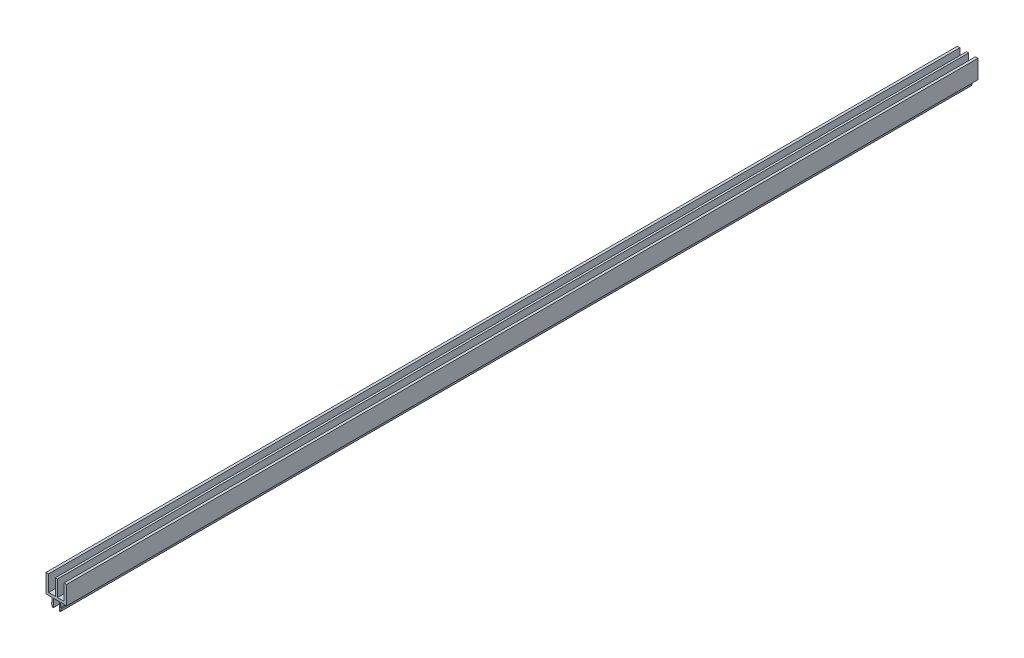
ISO-10303-21;
HEADER;
FILE_DESCRIPTION(('STEP AP214'),'2;1');
FILE_NAME('part.step','',(''),(''),'','','');
FILE_SCHEMA(('AUTOMOTIVE_DESIGN { 1 0 10303 214 1 1 1 1 }'));
ENDSEC;
DATA;
#1=APPLICATION_CONTEXT('core data for automotive mechanical design processes');
#2=APPLICATION_PROTOCOL_DEFINITION('international standard','automotive_design',2000,#1);
#3=PRODUCT_CONTEXT('',#1,'mechanical');
#4=PRODUCT('Part','Part','',(#3));
#5=PRODUCT_RELATED_PRODUCT_CATEGORY('part','',(#4));
#6=PRODUCT_DEFINITION_FORMATION('','',#4);
#7=PRODUCT_DEFINITION_CONTEXT('part definition',#1,'design');
#8=PRODUCT_DEFINITION('design','',#6,#7);
#9=PRODUCT_DEFINITION_SHAPE('','',#8);
#10=(LENGTH_UNIT() NAMED_UNIT(*) SI_UNIT(.MILLI.,.METRE.));
#11=(NAMED_UNIT(*) PLANE_ANGLE_UNIT() SI_UNIT($,.RADIAN.));
#12=(NAMED_UNIT(*) SI_UNIT($,.STERADIAN.) SOLID_ANGLE_UNIT());
#13=UNCERTAINTY_MEASURE_WITH_UNIT(LENGTH_MEASURE(1.E-05),#10,'distance_accuracy_value','');
#14=(GEOMETRIC_REPRESENTATION_CONTEXT(3) GLOBAL_UNCERTAINTY_ASSIGNED_CONTEXT((#13)) GLOBAL_UNIT_ASSIGNED_CONTEXT((#10,
#11,#12)) REPRESENTATION_CONTEXT('',''));
#15=CARTESIAN_POINT('',(0.,0.,0.));
#16=DIRECTION('',(0.,0.,1.));
#17=DIRECTION('',(1.,0.,0.));
#18=AXIS2_PLACEMENT_3D('',#15,#16,#17);
#19=CARTESIAN_POINT('',(-1.,17.9999999975,-829.));
#20=DIRECTION('',(-1.,0.,0.));
#21=DIRECTION('',(0.,-1.,0.));
#22=AXIS2_PLACEMENT_3D('',#19,#20,#21);
#23=PLANE('',#22);
#24=DIRECTION('',(0.,-1.,0.));
#25=VECTOR('',#24,1.);
#26=CARTESIAN_POINT('',(-1.,17.9999999975,50.));
#27=LINE('',#26,#25);
#28=CARTESIAN_POINT('',(-1.,17.9999999975,50.));
#29=VERTEX_POINT('',#28);
#30=CARTESIAN_POINT('',(-1.,2.4999999995,50.));
#31=VERTEX_POINT('',#30);
#32=EDGE_CURVE('E226',#29,#31,#27,.T.);
#33=ORIENTED_EDGE('',*,*,#32,.F.);
#34=DIRECTION('',(0.,0.,1.));
#35=VECTOR('',#34,1.);
#36=CARTESIAN_POINT('',(-1.,17.9999999975,-829.));
#37=LINE('',#36,#35);
#38=CARTESIAN_POINT('',(-1.,17.9999999975,-829.));
#39=VERTEX_POINT('',#38);
#40=EDGE_CURVE('E11',#39,#29,#37,.T.);
#41=ORIENTED_EDGE('',*,*,#40,.F.);
#42=DIRECTION('',(0.,-1.,0.));
#43=VECTOR('',#42,1.);
#44=CARTESIAN_POINT('',(-1.,17.9999999975,-829.));
#45=LINE('',#44,#43);
#46=CARTESIAN_POINT('',(-1.,2.4999999995,-829.));
#47=VERTEX_POINT('',#46);
#48=EDGE_CURVE('E294',#39,#47,#45,.T.);
#49=ORIENTED_EDGE('',*,*,#48,.T.);
#50=DIRECTION('',(0.,0.,1.));
#51=VECTOR('',#50,1.);
#52=CARTESIAN_POINT('',(-1.,2.4999999995,-829.));
#53=LINE('',#52,#51);
#54=EDGE_CURVE('E36',#47,#31,#53,.T.);
#55=ORIENTED_EDGE('',*,*,#54,.T.);
#56=EDGE_LOOP('',(#33,#41,#49,#55));
#57=FACE_BOUND('',#56,.T.);
#58=ADVANCED_FACE('F33',(#57),#23,.T.);
#59=CARTESIAN_POINT('',(0.999999999999998,17.9999999975,-829.));
#60=DIRECTION('',(0.,1.,0.));
#61=DIRECTION('',(0.,0.,1.));
#62=AXIS2_PLACEMENT_3D('',#59,#60,#61);
#63=PLANE('',#62);
#64=DIRECTION('',(-1.,0.,0.));
#65=VECTOR('',#64,1.);
#66=CARTESIAN_POINT('',(0.999999999999998,17.9999999975,50.));
#67=LINE('',#66,#65);
#68=CARTESIAN_POINT('',(0.999999999999998,17.9999999975,50.));
#69=VERTEX_POINT('',#68);
#70=EDGE_CURVE('E292',#69,#29,#67,.T.);
#71=ORIENTED_EDGE('',*,*,#70,.F.);
#72=DIRECTION('',(0.,0.,1.));
#73=VECTOR('',#72,1.);
#74=CARTESIAN_POINT('',(0.999999999999998,17.9999999975,-829.));
#75=LINE('',#74,#73);
#76=CARTESIAN_POINT('',(0.999999999999998,17.9999999975,-829.));
#77=VERTEX_POINT('',#76);
#78=EDGE_CURVE('E42',#77,#69,#75,.T.);
#79=ORIENTED_EDGE('',*,*,#78,.F.);
#80=DIRECTION('',(-1.,0.,0.));
#81=VECTOR('',#80,1.);
#82=CARTESIAN_POINT('',(0.999999999999998,17.9999999975,-829.));
#83=LINE('',#82,#81);
#84=EDGE_CURVE('E216',#77,#39,#83,.T.);
#85=ORIENTED_EDGE('',*,*,#84,.T.);
#86=ORIENTED_EDGE('',*,*,#40,.T.);
#87=EDGE_LOOP('',(#71,#79,#85,#86));
#88=FACE_BOUND('',#87,.T.);
#89=ADVANCED_FACE('F338',(#88),#63,.T.);
#90=CARTESIAN_POINT('',(0.999999999999998,2.4999999995,-829.));
#91=DIRECTION('',(1.,0.,0.));
#92=DIRECTION('',(0.,0.,-1.));
#93=AXIS2_PLACEMENT_3D('',#90,#91,#92);
#94=PLANE('',#93);
#95=DIRECTION('',(0.,1.,0.));
#96=VECTOR('',#95,1.);
#97=CARTESIAN_POINT('',(0.999999999999998,2.4999999995,50.));
#98=LINE('',#97,#96);
#99=CARTESIAN_POINT('',(0.999999999999998,2.4999999995,50.));
#100=VERTEX_POINT('',#99);
#101=EDGE_CURVE('E203',#100,#69,#98,.T.);
#102=ORIENTED_EDGE('',*,*,#101,.F.);
#103=DIRECTION('',(0.,0.,1.));
#104=VECTOR('',#103,1.);
#105=CARTESIAN_POINT('',(0.999999999999998,2.4999999995,-829.));
#106=LINE('',#105,#104);
#107=CARTESIAN_POINT('',(0.999999999999998,2.4999999995,-829.));
#108=VERTEX_POINT('',#107);
#109=EDGE_CURVE('E198',#108,#100,#106,.T.);
#110=ORIENTED_EDGE('',*,*,#109,.F.);
#111=DIRECTION('',(0.,1.,0.));
#112=VECTOR('',#111,1.);
#113=CARTESIAN_POINT('',(0.999999999999998,2.4999999995,-829.));
#114=LINE('',#113,#112);
#115=EDGE_CURVE('E201',#108,#77,#114,.T.);
#116=ORIENTED_EDGE('',*,*,#115,.T.);
#117=ORIENTED_EDGE('',*,*,#78,.T.);
#118=EDGE_LOOP('',(#102,#110,#116,#117));
#119=FACE_BOUND('',#118,.T.);
#120=ADVANCED_FACE('F200',(#119),#94,.T.);
#121=CARTESIAN_POINT('',(7.5,2.4999999995,-829.));
#122=DIRECTION('',(0.,1.,0.));
#123=DIRECTION('',(-1.,0.,0.));
#124=AXIS2_PLACEMENT_3D('',#121,#122,#123);
#125=PLANE('',#124);
#126=DIRECTION('',(-1.,0.,0.));
#127=VECTOR('',#126,1.);
#128=CARTESIAN_POINT('',(7.5,2.4999999995,50.));
#129=LINE('',#128,#127);
#130=CARTESIAN_POINT('',(7.5,2.4999999995,50.));
#131=VERTEX_POINT('',#130);
#132=EDGE_CURVE('E289',#131,#100,#129,.T.);
#133=ORIENTED_EDGE('',*,*,#132,.F.);
#134=DIRECTION('',(0.,0.,1.));
#135=VECTOR('',#134,1.);
#136=CARTESIAN_POINT('',(7.5,2.4999999995,-829.));
#137=LINE('',#136,#135);
#138=CARTESIAN_POINT('',(7.5,2.4999999995,-829.));
#139=VERTEX_POINT('',#138);
#140=EDGE_CURVE('E208',#139,#131,#137,.T.);
#141=ORIENTED_EDGE('',*,*,#140,.F.);
#142=DIRECTION('',(-1.,0.,0.));
#143=VECTOR('',#142,1.);
#144=CARTESIAN_POINT('',(7.5,2.4999999995,-829.));
#145=LINE('',#144,#143);
#146=EDGE_CURVE('E214',#139,#108,#145,.T.);
#147=ORIENTED_EDGE('',*,*,#146,.T.);
#148=ORIENTED_EDGE('',*,*,#109,.T.);
#149=EDGE_LOOP('',(#133,#141,#147,#148));
#150=FACE_BOUND('',#149,.T.);
#151=ADVANCED_FACE('F218',(#150),#125,.T.);
#152=CARTESIAN_POINT('',(7.5,17.9999999975,-829.));
#153=DIRECTION('',(-1.,0.,0.));
#154=DIRECTION('',(0.,-1.,0.));
#155=AXIS2_PLACEMENT_3D('',#152,#153,#154);
#156=PLANE('',#155);
#157=DIRECTION('',(0.,-1.,0.));
#158=VECTOR('',#157,1.);
#159=CARTESIAN_POINT('',(7.5,17.9999999975,50.));
#160=LINE('',#159,#158);
#161=CARTESIAN_POINT('',(7.5,17.9999999975,50.));
#162=VERTEX_POINT('',#161);
#163=EDGE_CURVE('E286',#162,#131,#160,.T.);
#164=ORIENTED_EDGE('',*,*,#163,.F.);
#165=DIRECTION('',(0.,0.,1.));
#166=VECTOR('',#165,1.);
#167=CARTESIAN_POINT('',(7.5,17.9999999975,-829.));
#168=LINE('',#167,#166);
#169=CARTESIAN_POINT('',(7.5,17.9999999975,-829.));
#170=VERTEX_POINT('',#169);
#171=EDGE_CURVE('E298',#170,#162,#168,.T.);
#172=ORIENTED_EDGE('',*,*,#171,.F.);
#173=DIRECTION('',(0.,-1.,0.));
#174=VECTOR('',#173,1.);
#175=CARTESIAN_POINT('',(7.5,17.9999999975,-829.));
#176=LINE('',#175,#174);
#177=EDGE_CURVE('E219',#170,#139,#176,.T.);
#178=ORIENTED_EDGE('',*,*,#177,.T.);
#179=ORIENTED_EDGE('',*,*,#140,.T.);
#180=EDGE_LOOP('',(#164,#172,#178,#179));
#181=FACE_BOUND('',#180,.T.);
#182=ADVANCED_FACE('F351',(#181),#156,.T.);
#183=CARTESIAN_POINT('',(10.,17.9999999975,-829.));
#184=DIRECTION('',(0.,1.,0.));
#185=DIRECTION('',(0.,0.,1.));
#186=AXIS2_PLACEMENT_3D('',#183,#184,#185);
#187=PLANE('',#186);
#188=DIRECTION('',(-1.,0.,0.));
#189=VECTOR('',#188,1.);
#190=CARTESIAN_POINT('',(10.,17.9999999975,50.));
#191=LINE('',#190,#189);
#192=CARTESIAN_POINT('',(10.,17.9999999975,50.));
#193=VERTEX_POINT('',#192);
#194=EDGE_CURVE('E283',#193,#162,#191,.T.);
#195=ORIENTED_EDGE('',*,*,#194,.F.);
#196=DIRECTION('',(0.,0.,1.));
#197=VECTOR('',#196,1.);
#198=CARTESIAN_POINT('',(10.,17.9999999975,-829.));
#199=LINE('',#198,#197);
#200=CARTESIAN_POINT('',(10.,17.9999999975,-829.));
#201=VERTEX_POINT('',#200);
#202=EDGE_CURVE('E300',#201,#193,#199,.T.);
#203=ORIENTED_EDGE('',*,*,#202,.F.);
#204=DIRECTION('',(-1.,0.,0.));
#205=VECTOR('',#204,1.);
#206=CARTESIAN_POINT('',(10.,17.9999999975,-829.));
#207=LINE('',#206,#205);
#208=EDGE_CURVE('E221',#201,#170,#207,.T.);
#209=ORIENTED_EDGE('',*,*,#208,.T.);
#210=ORIENTED_EDGE('',*,*,#171,.T.);
#211=EDGE_LOOP('',(#195,#203,#209,#210));
#212=FACE_BOUND('',#211,.T.);
#213=ADVANCED_FACE('F354',(#212),#187,.T.);
#214=CARTESIAN_POINT('',(10.,-4.99999828349541E-10,-829.));
#215=DIRECTION('',(1.,0.,0.));
#216=DIRECTION('',(0.,0.,-1.));
#217=AXIS2_PLACEMENT_3D('',#214,#215,#216);
#218=PLANE('',#217);
#219=DIRECTION('',(0.,1.,0.));
#220=VECTOR('',#219,1.);
#221=CARTESIAN_POINT('',(10.,-4.99999828349541E-10,50.));
#222=LINE('',#221,#220);
#223=CARTESIAN_POINT('',(10.,-4.99999828349541E-10,50.));
#224=VERTEX_POINT('',#223);
#225=EDGE_CURVE('E280',#224,#193,#222,.T.);
#226=ORIENTED_EDGE('',*,*,#225,.F.);
#227=DIRECTION('',(0.,0.,1.));
#228=VECTOR('',#227,1.);
#229=CARTESIAN_POINT('',(10.,-4.99999828349541E-10,-829.));
#230=LINE('',#229,#228);
#231=CARTESIAN_POINT('',(10.,-4.99999828349541E-10,-829.));
#232=VERTEX_POINT('',#231);
#233=EDGE_CURVE('E302',#232,#224,#230,.T.);
#234=ORIENTED_EDGE('',*,*,#233,.F.);
#235=DIRECTION('',(0.,1.,0.));
#236=VECTOR('',#235,1.);
#237=CARTESIAN_POINT('',(10.,-4.99999828349541E-10,-829.));
#238=LINE('',#237,#236);
#239=EDGE_CURVE('E644',#232,#201,#238,.T.);
#240=ORIENTED_EDGE('',*,*,#239,.T.);
#241=ORIENTED_EDGE('',*,*,#202,.T.);
#242=EDGE_LOOP('',(#226,#234,#240,#241));
#243=FACE_BOUND('',#242,.T.);
#244=ADVANCED_FACE('F358',(#243),#218,.T.);
#245=CARTESIAN_POINT('',(4.,-4.99999998002099E-10,-829.));
#246=DIRECTION('',(0.,-1.,0.));
#247=DIRECTION('',(1.,0.,0.));
#248=AXIS2_PLACEMENT_3D('',#245,#246,#247);
#249=PLANE('',#248);
#250=DIRECTION('',(1.,0.,0.));
#251=VECTOR('',#250,1.);
#252=CARTESIAN_POINT('',(4.,-4.99999998002099E-10,50.));
#253=LINE('',#252,#251);
#254=CARTESIAN_POINT('',(4.,-4.99999998002099E-10,50.));
#255=VERTEX_POINT('',#254);
#256=EDGE_CURVE('E277',#255,#224,#253,.T.);
#257=ORIENTED_EDGE('',*,*,#256,.F.);
#258=DIRECTION('',(0.,0.,1.));
#259=VECTOR('',#258,1.);
#260=CARTESIAN_POINT('',(4.,-4.99999998002099E-10,-829.));
#261=LINE('',#260,#259);
#262=CARTESIAN_POINT('',(4.,-4.99999998002099E-10,-829.));
#263=VERTEX_POINT('',#262);
#264=EDGE_CURVE('E304',#263,#255,#261,.T.);
#265=ORIENTED_EDGE('',*,*,#264,.F.);
#266=DIRECTION('',(1.,0.,0.));
#267=VECTOR('',#266,1.);
#268=CARTESIAN_POINT('',(4.,-4.99999998002099E-10,-829.));
#269=LINE('',#268,#267);
#270=EDGE_CURVE('E648',#263,#232,#269,.T.);
#271=ORIENTED_EDGE('',*,*,#270,.T.);
#272=ORIENTED_EDGE('',*,*,#233,.T.);
#273=EDGE_LOOP('',(#257,#265,#271,#272));
#274=FACE_BOUND('',#273,.T.);
#275=ADVANCED_FACE('F362',(#274),#249,.T.);
#276=CARTESIAN_POINT('',(4.,-4.5,-829.));
#277=DIRECTION('',(1.,0.,0.));
#278=DIRECTION('',(0.,0.,-1.));
#279=AXIS2_PLACEMENT_3D('',#276,#277,#278);
#280=PLANE('',#279);
#281=DIRECTION('',(0.,1.,0.));
#282=VECTOR('',#281,1.);
#283=CARTESIAN_POINT('',(4.,-4.5,50.));
#284=LINE('',#283,#282);
#285=CARTESIAN_POINT('',(4.,-4.5,50.));
#286=VERTEX_POINT('',#285);
#287=EDGE_CURVE('E274',#286,#255,#284,.T.);
#288=ORIENTED_EDGE('',*,*,#287,.F.);
#289=DIRECTION('',(0.,0.,1.));
#290=VECTOR('',#289,1.);
#291=CARTESIAN_POINT('',(4.,-4.5,-829.));
#292=LINE('',#291,#290);
#293=CARTESIAN_POINT('',(4.,-4.5,-829.));
#294=VERTEX_POINT('',#293);
#295=EDGE_CURVE('E306',#294,#286,#292,.T.);
#296=ORIENTED_EDGE('',*,*,#295,.F.);
#297=DIRECTION('',(0.,1.,0.));
#298=VECTOR('',#297,1.);
#299=CARTESIAN_POINT('',(4.,-4.5,-829.));
#300=LINE('',#299,#298);
#301=EDGE_CURVE('E637',#294,#263,#300,.T.);
#302=ORIENTED_EDGE('',*,*,#301,.T.);
#303=ORIENTED_EDGE('',*,*,#264,.T.);
#304=EDGE_LOOP('',(#288,#296,#302,#303));
#305=FACE_BOUND('',#304,.T.);
#306=ADVANCED_FACE('F366',(#305),#280,.T.);
#307=CARTESIAN_POINT('',(5.,-4.5,-829.));
#308=DIRECTION('',(0.,1.,0.));
#309=DIRECTION('',(0.,0.,1.));
#310=AXIS2_PLACEMENT_3D('',#307,#308,#309);
#311=PLANE('',#310);
#312=DIRECTION('',(-1.,0.,0.));
#313=VECTOR('',#312,1.);
#314=CARTESIAN_POINT('',(5.,-4.5,50.));
#315=LINE('',#314,#313);
#316=CARTESIAN_POINT('',(5.,-4.5,50.));
#317=VERTEX_POINT('',#316);
#318=EDGE_CURVE('E271',#317,#286,#315,.T.);
#319=ORIENTED_EDGE('',*,*,#318,.F.);
#320=DIRECTION('',(0.,0.,1.));
#321=VECTOR('',#320,1.);
#322=CARTESIAN_POINT('',(5.,-4.5,-829.));
#323=LINE('',#322,#321);
#324=CARTESIAN_POINT('',(5.,-4.5,-829.));
#325=VERTEX_POINT('',#324);
#326=EDGE_CURVE('E308',#325,#317,#323,.T.);
#327=ORIENTED_EDGE('',*,*,#326,.F.);
#328=DIRECTION('',(-1.,0.,0.));
#329=VECTOR('',#328,1.);
#330=CARTESIAN_POINT('',(5.,-4.5,-829.));
#331=LINE('',#330,#329);
#332=EDGE_CURVE('E633',#325,#294,#331,.T.);
#333=ORIENTED_EDGE('',*,*,#332,.T.);
#334=ORIENTED_EDGE('',*,*,#295,.T.);
#335=EDGE_LOOP('',(#319,#327,#333,#334));
#336=FACE_BOUND('',#335,.T.);
#337=ADVANCED_FACE('F370',(#336),#311,.T.);
#338=CARTESIAN_POINT('',(3.75,-8.,-829.));
#339=DIRECTION('',(0.941741911594837,-0.336336396998157,0.));
#340=DIRECTION('',(0.336336396998157,0.941741911594837,0.));
#341=AXIS2_PLACEMENT_3D('',#338,#339,#340);
#342=PLANE('',#341);
#343=DIRECTION('',(0.336336396998157,0.941741911594837,0.));
#344=VECTOR('',#343,1.);
#345=CARTESIAN_POINT('',(3.75,-8.,50.));
#346=LINE('',#345,#344);
#347=CARTESIAN_POINT('',(3.75,-8.,50.));
#348=VERTEX_POINT('',#347);
#349=EDGE_CURVE('E268',#348,#317,#346,.T.);
#350=ORIENTED_EDGE('',*,*,#349,.F.);
#351=DIRECTION('',(0.,0.,1.));
#352=VECTOR('',#351,1.);
#353=CARTESIAN_POINT('',(3.75,-8.,-829.));
#354=LINE('',#353,#352);
#355=CARTESIAN_POINT('',(3.75,-8.,-829.));
#356=VERTEX_POINT('',#355);
#357=EDGE_CURVE('E310',#356,#348,#354,.T.);
#358=ORIENTED_EDGE('',*,*,#357,.F.);
#359=DIRECTION('',(0.336336396998157,0.941741911594837,0.));
#360=VECTOR('',#359,1.);
#361=CARTESIAN_POINT('',(3.75,-8.,-829.));
#362=LINE('',#361,#360);
#363=EDGE_CURVE('E654',#356,#325,#362,.T.);
#364=ORIENTED_EDGE('',*,*,#363,.T.);
#365=ORIENTED_EDGE('',*,*,#326,.T.);
#366=EDGE_LOOP('',(#350,#358,#364,#365));
#367=FACE_BOUND('',#366,.T.);
#368=ADVANCED_FACE('F374',(#367),#342,.T.);
#369=CARTESIAN_POINT('',(3.,-8.,-829.));
#370=DIRECTION('',(0.,-1.,0.));
#371=DIRECTION('',(0.,0.,-1.));
#372=AXIS2_PLACEMENT_3D('',#369,#370,#371);
#373=PLANE('',#372);
#374=DIRECTION('',(1.,0.,0.));
#375=VECTOR('',#374,1.);
#376=CARTESIAN_POINT('',(3.,-8.,50.));
#377=LINE('',#376,#375);
#378=CARTESIAN_POINT('',(3.,-8.,50.));
#379=VERTEX_POINT('',#378);
#380=EDGE_CURVE('E265',#379,#348,#377,.T.);
#381=ORIENTED_EDGE('',*,*,#380,.F.);
#382=DIRECTION('',(0.,0.,1.));
#383=VECTOR('',#382,1.);
#384=CARTESIAN_POINT('',(3.,-8.,-829.));
#385=LINE('',#384,#383);
#386=CARTESIAN_POINT('',(3.,-8.,-829.));
#387=VERTEX_POINT('',#386);
#388=EDGE_CURVE('E312',#387,#379,#385,.T.);
#389=ORIENTED_EDGE('',*,*,#388,.F.);
#390=DIRECTION('',(1.,0.,0.));
#391=VECTOR('',#390,1.);
#392=CARTESIAN_POINT('',(3.,-8.,-829.));
#393=LINE('',#392,#391);
#394=EDGE_CURVE('E626',#387,#356,#393,.T.);
#395=ORIENTED_EDGE('',*,*,#394,.T.);
#396=ORIENTED_EDGE('',*,*,#357,.T.);
#397=EDGE_LOOP('',(#381,#389,#395,#396));
#398=FACE_BOUND('',#397,.T.);
#399=ADVANCED_FACE('F378',(#398),#373,.T.);
#400=CARTESIAN_POINT('',(3.,-4.9999985194348E-10,-829.));
#401=DIRECTION('',(-1.,0.,0.));
#402=DIRECTION('',(0.,0.,1.));
#403=AXIS2_PLACEMENT_3D('',#400,#401,#402);
#404=PLANE('',#403);
#405=DIRECTION('',(0.,-1.,0.));
#406=VECTOR('',#405,1.);
#407=CARTESIAN_POINT('',(3.,-4.9999985194348E-10,50.));
#408=LINE('',#407,#406);
#409=CARTESIAN_POINT('',(3.,-4.9999985194348E-10,50.));
#410=VERTEX_POINT('',#409);
#411=EDGE_CURVE('E262',#410,#379,#408,.T.);
#412=ORIENTED_EDGE('',*,*,#411,.F.);
#413=DIRECTION('',(0.,0.,1.));
#414=VECTOR('',#413,1.);
#415=CARTESIAN_POINT('',(3.,-4.9999985194348E-10,-829.));
#416=LINE('',#415,#414);
#417=CARTESIAN_POINT('',(3.,-4.9999985194348E-10,-829.));
#418=VERTEX_POINT('',#417);
#419=EDGE_CURVE('E314',#418,#410,#416,.T.);
#420=ORIENTED_EDGE('',*,*,#419,.F.);
#421=DIRECTION('',(0.,-1.,0.));
#422=VECTOR('',#421,1.);
#423=CARTESIAN_POINT('',(3.,-4.9999985194348E-10,-829.));
#424=LINE('',#423,#422);
#425=EDGE_CURVE('E622',#418,#387,#424,.T.);
#426=ORIENTED_EDGE('',*,*,#425,.T.);
#427=ORIENTED_EDGE('',*,*,#388,.T.);
#428=EDGE_LOOP('',(#412,#420,#426,#427));
#429=FACE_BOUND('',#428,.T.);
#430=ADVANCED_FACE('F382',(#429),#404,.T.);
#431=CARTESIAN_POINT('',(-3.,-4.99999455901012E-10,-829.));
#432=DIRECTION('',(0.,-1.,0.));
#433=DIRECTION('',(1.,0.,0.));
#434=AXIS2_PLACEMENT_3D('',#431,#432,#433);
#435=PLANE('',#434);
#436=DIRECTION('',(1.,0.,0.));
#437=VECTOR('',#436,1.);
#438=CARTESIAN_POINT('',(-3.,-4.99999455901012E-10,50.));
#439=LINE('',#438,#437);
#440=CARTESIAN_POINT('',(-3.,-4.99999455901012E-10,50.));
#441=VERTEX_POINT('',#440);
#442=EDGE_CURVE('E259',#441,#410,#439,.T.);
#443=ORIENTED_EDGE('',*,*,#442,.F.);
#444=DIRECTION('',(0.,0.,1.));
#445=VECTOR('',#444,1.);
#446=CARTESIAN_POINT('',(-3.,-4.99999455901012E-10,-829.));
#447=LINE('',#446,#445);
#448=CARTESIAN_POINT('',(-3.,-4.99999455901012E-10,-829.));
#449=VERTEX_POINT('',#448);
#450=EDGE_CURVE('E316',#449,#441,#447,.T.);
#451=ORIENTED_EDGE('',*,*,#450,.F.);
#452=DIRECTION('',(1.,0.,0.));
#453=VECTOR('',#452,1.);
#454=CARTESIAN_POINT('',(-3.,-4.99999455901012E-10,-829.));
#455=LINE('',#454,#453);
#456=EDGE_CURVE('E658',#449,#418,#455,.T.);
#457=ORIENTED_EDGE('',*,*,#456,.T.);
#458=ORIENTED_EDGE('',*,*,#419,.T.);
#459=EDGE_LOOP('',(#443,#451,#457,#458));
#460=FACE_BOUND('',#459,.T.);
#461=ADVANCED_FACE('F386',(#460),#435,.T.);
#462=CARTESIAN_POINT('',(-3.,-8.,-829.));
#463=DIRECTION('',(1.,0.,0.));
#464=DIRECTION('',(0.,0.,-1.));
#465=AXIS2_PLACEMENT_3D('',#462,#463,#464);
#466=PLANE('',#465);
#467=DIRECTION('',(0.,1.,0.));
#468=VECTOR('',#467,1.);
#469=CARTESIAN_POINT('',(-3.,-8.,50.));
#470=LINE('',#469,#468);
#471=CARTESIAN_POINT('',(-3.,-8.,50.));
#472=VERTEX_POINT('',#471);
#473=EDGE_CURVE('E256',#472,#441,#470,.T.);
#474=ORIENTED_EDGE('',*,*,#473,.F.);
#475=DIRECTION('',(0.,0.,1.));
#476=VECTOR('',#475,1.);
#477=CARTESIAN_POINT('',(-3.,-8.,-829.));
#478=LINE('',#477,#476);
#479=CARTESIAN_POINT('',(-3.,-8.,-829.));
#480=VERTEX_POINT('',#479);
#481=EDGE_CURVE('E318',#480,#472,#478,.T.);
#482=ORIENTED_EDGE('',*,*,#481,.F.);
#483=DIRECTION('',(0.,1.,0.));
#484=VECTOR('',#483,1.);
#485=CARTESIAN_POINT('',(-3.,-8.,-829.));
#486=LINE('',#485,#484);
#487=EDGE_CURVE('E615',#480,#449,#486,.T.);
#488=ORIENTED_EDGE('',*,*,#487,.T.);
#489=ORIENTED_EDGE('',*,*,#450,.T.);
#490=EDGE_LOOP('',(#474,#482,#488,#489));
#491=FACE_BOUND('',#490,.T.);
#492=ADVANCED_FACE('F390',(#491),#466,.T.);
#493=CARTESIAN_POINT('',(-3.75,-8.,-829.));
#494=DIRECTION('',(0.,-1.,0.));
#495=DIRECTION('',(0.,0.,-1.));
#496=AXIS2_PLACEMENT_3D('',#493,#494,#495);
#497=PLANE('',#496);
#498=DIRECTION('',(1.,0.,0.));
#499=VECTOR('',#498,1.);
#500=CARTESIAN_POINT('',(-3.75,-8.,50.));
#501=LINE('',#500,#499);
#502=CARTESIAN_POINT('',(-3.75,-8.,50.));
#503=VERTEX_POINT('',#502);
#504=EDGE_CURVE('E253',#503,#472,#501,.T.);
#505=ORIENTED_EDGE('',*,*,#504,.F.);
#506=DIRECTION('',(0.,0.,1.));
#507=VECTOR('',#506,1.);
#508=CARTESIAN_POINT('',(-3.75,-8.,-829.));
#509=LINE('',#508,#507);
#510=CARTESIAN_POINT('',(-3.75,-8.,-829.));
#511=VERTEX_POINT('',#510);
#512=EDGE_CURVE('E320',#511,#503,#509,.T.);
#513=ORIENTED_EDGE('',*,*,#512,.F.);
#514=DIRECTION('',(1.,0.,0.));
#515=VECTOR('',#514,1.);
#516=CARTESIAN_POINT('',(-3.75,-8.,-829.));
#517=LINE('',#516,#515);
#518=EDGE_CURVE('E611',#511,#480,#517,.T.);
#519=ORIENTED_EDGE('',*,*,#518,.T.);
#520=ORIENTED_EDGE('',*,*,#481,.T.);
#521=EDGE_LOOP('',(#505,#513,#519,#520));
#522=FACE_BOUND('',#521,.T.);
#523=ADVANCED_FACE('F394',(#522),#497,.T.);
#524=CARTESIAN_POINT('',(-5.,-4.5,-829.));
#525=DIRECTION('',(-0.941741911594837,-0.336336396998156,0.));
#526=DIRECTION('',(0.336336396998156,-0.941741911594838,0.));
#527=AXIS2_PLACEMENT_3D('',#524,#525,#526);
#528=PLANE('',#527);
#529=DIRECTION('',(0.336336396998156,-0.941741911594837,0.));
#530=VECTOR('',#529,1.);
#531=CARTESIAN_POINT('',(-5.,-4.5,50.));
#532=LINE('',#531,#530);
#533=CARTESIAN_POINT('',(-5.,-4.5,50.));
#534=VERTEX_POINT('',#533);
#535=EDGE_CURVE('E250',#534,#503,#532,.T.);
#536=ORIENTED_EDGE('',*,*,#535,.F.);
#537=DIRECTION('',(0.,0.,1.));
#538=VECTOR('',#537,1.);
#539=CARTESIAN_POINT('',(-5.,-4.5,-829.));
#540=LINE('',#539,#538);
#541=CARTESIAN_POINT('',(-5.,-4.5,-829.));
#542=VERTEX_POINT('',#541);
#543=EDGE_CURVE('E322',#542,#534,#540,.T.);
#544=ORIENTED_EDGE('',*,*,#543,.F.);
#545=DIRECTION('',(0.336336396998156,-0.941741911594837,0.));
#546=VECTOR('',#545,1.);
#547=CARTESIAN_POINT('',(-5.,-4.5,-829.));
#548=LINE('',#547,#546);
#549=EDGE_CURVE('E662',#542,#511,#548,.T.);
#550=ORIENTED_EDGE('',*,*,#549,.T.);
#551=ORIENTED_EDGE('',*,*,#512,.T.);
#552=EDGE_LOOP('',(#536,#544,#550,#551));
#553=FACE_BOUND('',#552,.T.);
#554=ADVANCED_FACE('F398',(#553),#528,.T.);
#555=CARTESIAN_POINT('',(-4.,-4.5,-829.));
#556=DIRECTION('',(0.,1.,0.));
#557=DIRECTION('',(0.,0.,1.));
#558=AXIS2_PLACEMENT_3D('',#555,#556,#557);
#559=PLANE('',#558);
#560=DIRECTION('',(-1.,0.,0.));
#561=VECTOR('',#560,1.);
#562=CARTESIAN_POINT('',(-4.,-4.5,50.));
#563=LINE('',#562,#561);
#564=CARTESIAN_POINT('',(-4.,-4.5,50.));
#565=VERTEX_POINT('',#564);
#566=EDGE_CURVE('E247',#565,#534,#563,.T.);
#567=ORIENTED_EDGE('',*,*,#566,.F.);
#568=DIRECTION('',(0.,0.,1.));
#569=VECTOR('',#568,1.);
#570=CARTESIAN_POINT('',(-4.,-4.5,-829.));
#571=LINE('',#570,#569);
#572=CARTESIAN_POINT('',(-4.,-4.5,-829.));
#573=VERTEX_POINT('',#572);
#574=EDGE_CURVE('E324',#573,#565,#571,.T.);
#575=ORIENTED_EDGE('',*,*,#574,.F.);
#576=DIRECTION('',(-1.,0.,0.));
#577=VECTOR('',#576,1.);
#578=CARTESIAN_POINT('',(-4.,-4.5,-829.));
#579=LINE('',#578,#577);
#580=EDGE_CURVE('E604',#573,#542,#579,.T.);
#581=ORIENTED_EDGE('',*,*,#580,.T.);
#582=ORIENTED_EDGE('',*,*,#543,.T.);
#583=EDGE_LOOP('',(#567,#575,#581,#582));
#584=FACE_BOUND('',#583,.T.);
#585=ADVANCED_FACE('F402',(#584),#559,.T.);
#586=CARTESIAN_POINT('',(-4.,-4.9999985194348E-10,-829.));
#587=DIRECTION('',(-1.,0.,0.));
#588=DIRECTION('',(0.,0.,1.));
#589=AXIS2_PLACEMENT_3D('',#586,#587,#588);
#590=PLANE('',#589);
#591=DIRECTION('',(0.,-1.,0.));
#592=VECTOR('',#591,1.);
#593=CARTESIAN_POINT('',(-4.,-4.9999985194348E-10,50.));
#594=LINE('',#593,#592);
#595=CARTESIAN_POINT('',(-4.,-4.9999985194348E-10,50.));
#596=VERTEX_POINT('',#595);
#597=EDGE_CURVE('E244',#596,#565,#594,.T.);
#598=ORIENTED_EDGE('',*,*,#597,.F.);
#599=DIRECTION('',(0.,0.,1.));
#600=VECTOR('',#599,1.);
#601=CARTESIAN_POINT('',(-4.,-4.9999985194348E-10,-829.));
#602=LINE('',#601,#600);
#603=CARTESIAN_POINT('',(-4.,-4.9999985194348E-10,-829.));
#604=VERTEX_POINT('',#603);
#605=EDGE_CURVE('E326',#604,#596,#602,.T.);
#606=ORIENTED_EDGE('',*,*,#605,.F.);
#607=DIRECTION('',(0.,-1.,0.));
#608=VECTOR('',#607,1.);
#609=CARTESIAN_POINT('',(-4.,-4.9999985194348E-10,-829.));
#610=LINE('',#609,#608);
#611=EDGE_CURVE('E600',#604,#573,#610,.T.);
#612=ORIENTED_EDGE('',*,*,#611,.T.);
#613=ORIENTED_EDGE('',*,*,#574,.T.);
#614=EDGE_LOOP('',(#598,#606,#612,#613));
#615=FACE_BOUND('',#614,.T.);
#616=ADVANCED_FACE('F406',(#615),#590,.T.);
#617=CARTESIAN_POINT('',(-10.,-4.99999719929324E-10,-829.));
#618=DIRECTION('',(0.,-1.,0.));
#619=DIRECTION('',(1.,0.,0.));
#620=AXIS2_PLACEMENT_3D('',#617,#618,#619);
#621=PLANE('',#620);
#622=DIRECTION('',(1.,0.,0.));
#623=VECTOR('',#622,1.);
#624=CARTESIAN_POINT('',(-10.,-4.99999719929324E-10,50.));
#625=LINE('',#624,#623);
#626=CARTESIAN_POINT('',(-10.,-4.99999719929324E-10,50.));
#627=VERTEX_POINT('',#626);
#628=EDGE_CURVE('E241',#627,#596,#625,.T.);
#629=ORIENTED_EDGE('',*,*,#628,.F.);
#630=DIRECTION('',(0.,0.,1.));
#631=VECTOR('',#630,1.);
#632=CARTESIAN_POINT('',(-10.,-4.99999719929324E-10,-829.));
#633=LINE('',#632,#631);
#634=CARTESIAN_POINT('',(-10.,-4.99999719929324E-10,-829.));
#635=VERTEX_POINT('',#634);
#636=EDGE_CURVE('E328',#635,#627,#633,.T.);
#637=ORIENTED_EDGE('',*,*,#636,.F.);
#638=DIRECTION('',(1.,0.,0.));
#639=VECTOR('',#638,1.);
#640=CARTESIAN_POINT('',(-10.,-4.99999719929324E-10,-829.));
#641=LINE('',#640,#639);
#642=EDGE_CURVE('E666',#635,#604,#641,.T.);
#643=ORIENTED_EDGE('',*,*,#642,.T.);
#644=ORIENTED_EDGE('',*,*,#605,.T.);
#645=EDGE_LOOP('',(#629,#637,#643,#644));
#646=FACE_BOUND('',#645,.T.);
#647=ADVANCED_FACE('F410',(#646),#621,.T.);
#648=CARTESIAN_POINT('',(-10.,17.9999999975,-829.));
#649=DIRECTION('',(-1.,0.,0.));
#650=DIRECTION('',(0.,-1.,0.));
#651=AXIS2_PLACEMENT_3D('',#648,#649,#650);
#652=PLANE('',#651);
#653=DIRECTION('',(0.,-1.,0.));
#654=VECTOR('',#653,1.);
#655=CARTESIAN_POINT('',(-10.,17.9999999975,50.));
#656=LINE('',#655,#654);
#657=CARTESIAN_POINT('',(-10.,17.9999999975,50.));
#658=VERTEX_POINT('',#657);
#659=EDGE_CURVE('E238',#658,#627,#656,.T.);
#660=ORIENTED_EDGE('',*,*,#659,.F.);
#661=DIRECTION('',(0.,0.,1.));
#662=VECTOR('',#661,1.);
#663=CARTESIAN_POINT('',(-10.,17.9999999975,-829.));
#664=LINE('',#663,#662);
#665=CARTESIAN_POINT('',(-10.,17.9999999975,-829.));
#666=VERTEX_POINT('',#665);
#667=EDGE_CURVE('E330',#666,#658,#664,.T.);
#668=ORIENTED_EDGE('',*,*,#667,.F.);
#669=DIRECTION('',(0.,-1.,0.));
#670=VECTOR('',#669,1.);
#671=CARTESIAN_POINT('',(-10.,17.9999999975,-829.));
#672=LINE('',#671,#670);
#673=EDGE_CURVE('E593',#666,#635,#672,.T.);
#674=ORIENTED_EDGE('',*,*,#673,.T.);
#675=ORIENTED_EDGE('',*,*,#636,.T.);
#676=EDGE_LOOP('',(#660,#668,#674,#675));
#677=FACE_BOUND('',#676,.T.);
#678=ADVANCED_FACE('F414',(#677),#652,.T.);
#679=CARTESIAN_POINT('',(-7.5,17.9999999975,-829.));
#680=DIRECTION('',(0.,1.,0.));
#681=DIRECTION('',(0.,0.,1.));
#682=AXIS2_PLACEMENT_3D('',#679,#680,#681);
#683=PLANE('',#682);
#684=DIRECTION('',(-1.,0.,0.));
#685=VECTOR('',#684,1.);
#686=CARTESIAN_POINT('',(-7.5,17.9999999975,50.));
#687=LINE('',#686,#685);
#688=CARTESIAN_POINT('',(-7.5,17.9999999975,50.));
#689=VERTEX_POINT('',#688);
#690=EDGE_CURVE('E235',#689,#658,#687,.T.);
#691=ORIENTED_EDGE('',*,*,#690,.F.);
#692=DIRECTION('',(0.,0.,1.));
#693=VECTOR('',#692,1.);
#694=CARTESIAN_POINT('',(-7.5,17.9999999975,-829.));
#695=LINE('',#694,#693);
#696=CARTESIAN_POINT('',(-7.5,17.9999999975,-829.));
#697=VERTEX_POINT('',#696);
#698=EDGE_CURVE('E332',#697,#689,#695,.T.);
#699=ORIENTED_EDGE('',*,*,#698,.F.);
#700=DIRECTION('',(-1.,0.,0.));
#701=VECTOR('',#700,1.);
#702=CARTESIAN_POINT('',(-7.5,17.9999999975,-829.));
#703=LINE('',#702,#701);
#704=EDGE_CURVE('E589',#697,#666,#703,.T.);
#705=ORIENTED_EDGE('',*,*,#704,.T.);
#706=ORIENTED_EDGE('',*,*,#667,.T.);
#707=EDGE_LOOP('',(#691,#699,#705,#706));
#708=FACE_BOUND('',#707,.T.);
#709=ADVANCED_FACE('F418',(#708),#683,.T.);
#710=CARTESIAN_POINT('',(-7.5,2.4999999995,-829.));
#711=DIRECTION('',(1.,0.,0.));
#712=DIRECTION('',(0.,0.,-1.));
#713=AXIS2_PLACEMENT_3D('',#710,#711,#712);
#714=PLANE('',#713);
#715=DIRECTION('',(0.,1.,0.));
#716=VECTOR('',#715,1.);
#717=CARTESIAN_POINT('',(-7.5,2.4999999995,50.));
#718=LINE('',#717,#716);
#719=CARTESIAN_POINT('',(-7.5,2.4999999995,50.));
#720=VERTEX_POINT('',#719);
#721=EDGE_CURVE('E232',#720,#689,#718,.T.);
#722=ORIENTED_EDGE('',*,*,#721,.F.);
#723=DIRECTION('',(0.,0.,1.));
#724=VECTOR('',#723,1.);
#725=CARTESIAN_POINT('',(-7.5,2.4999999995,-829.));
#726=LINE('',#725,#724);
#727=CARTESIAN_POINT('',(-7.5,2.4999999995,-829.));
#728=VERTEX_POINT('',#727);
#729=EDGE_CURVE('E333',#728,#720,#726,.T.);
#730=ORIENTED_EDGE('',*,*,#729,.F.);
#731=DIRECTION('',(0.,1.,0.));
#732=VECTOR('',#731,1.);
#733=CARTESIAN_POINT('',(-7.5,2.4999999995,-829.));
#734=LINE('',#733,#732);
#735=EDGE_CURVE('E670',#728,#697,#734,.T.);
#736=ORIENTED_EDGE('',*,*,#735,.T.);
#737=ORIENTED_EDGE('',*,*,#698,.T.);
#738=EDGE_LOOP('',(#722,#730,#736,#737));
#739=FACE_BOUND('',#738,.T.);
#740=ADVANCED_FACE('F422',(#739),#714,.T.);
#741=CARTESIAN_POINT('',(-1.,2.4999999995,-829.));
#742=DIRECTION('',(0.,1.,0.));
#743=DIRECTION('',(-1.,0.,0.));
#744=AXIS2_PLACEMENT_3D('',#741,#742,#743);
#745=PLANE('',#744);
#746=DIRECTION('',(-1.,0.,0.));
#747=VECTOR('',#746,1.);
#748=CARTESIAN_POINT('',(-1.,2.4999999995,50.));
#749=LINE('',#748,#747);
#750=EDGE_CURVE('E229',#31,#720,#749,.T.);
#751=ORIENTED_EDGE('',*,*,#750,.F.);
#752=ORIENTED_EDGE('',*,*,#54,.F.);
#753=DIRECTION('',(-1.,0.,0.));
#754=VECTOR('',#753,1.);
#755=CARTESIAN_POINT('',(-1.,2.4999999995,-829.));
#756=LINE('',#755,#754);
#757=EDGE_CURVE('E672',#47,#728,#756,.T.);
#758=ORIENTED_EDGE('',*,*,#757,.T.);
#759=ORIENTED_EDGE('',*,*,#729,.T.);
#760=EDGE_LOOP('',(#751,#752,#758,#759));
#761=FACE_BOUND('',#760,.T.);
#762=ADVANCED_FACE('F335',(#761),#745,.T.);
#763=CARTESIAN_POINT('',(0.,0.,-829.));
#764=DIRECTION('',(0.,0.,-1.));
#765=DIRECTION('',(-1.,0.,0.));
#766=AXIS2_PLACEMENT_3D('',#763,#764,#765);
#767=PLANE('',#766);
#768=ORIENTED_EDGE('',*,*,#48,.F.);
#769=ORIENTED_EDGE('',*,*,#84,.F.);
#770=ORIENTED_EDGE('',*,*,#115,.F.);
#771=ORIENTED_EDGE('',*,*,#146,.F.);
#772=ORIENTED_EDGE('',*,*,#177,.F.);
#773=ORIENTED_EDGE('',*,*,#208,.F.);
#774=ORIENTED_EDGE('',*,*,#239,.F.);
#775=ORIENTED_EDGE('',*,*,#270,.F.);
#776=ORIENTED_EDGE('',*,*,#301,.F.);
#777=ORIENTED_EDGE('',*,*,#332,.F.);
#778=ORIENTED_EDGE('',*,*,#363,.F.);
#779=ORIENTED_EDGE('',*,*,#394,.F.);
#780=ORIENTED_EDGE('',*,*,#425,.F.);
#781=ORIENTED_EDGE('',*,*,#456,.F.);
#782=ORIENTED_EDGE('',*,*,#487,.F.);
#783=ORIENTED_EDGE('',*,*,#518,.F.);
#784=ORIENTED_EDGE('',*,*,#549,.F.);
#785=ORIENTED_EDGE('',*,*,#580,.F.);
#786=ORIENTED_EDGE('',*,*,#611,.F.);
#787=ORIENTED_EDGE('',*,*,#642,.F.);
#788=ORIENTED_EDGE('',*,*,#673,.F.);
#789=ORIENTED_EDGE('',*,*,#704,.F.);
#790=ORIENTED_EDGE('',*,*,#735,.F.);
#791=ORIENTED_EDGE('',*,*,#757,.F.);
#792=EDGE_LOOP('',(#768,#769,#770,#771,#772,#773,#774,#775,#776,#777,#778,#779,#780,#781,#782,
#783,#784,#785,#786,#787,#788,#789,#790,#791));
#793=FACE_BOUND('',#792,.T.);
#794=ADVANCED_FACE('F212',(#793),#767,.T.);
#795=CARTESIAN_POINT('',(0.,0.,50.));
#796=DIRECTION('',(0.,0.,-1.));
#797=DIRECTION('',(-1.,0.,0.));
#798=AXIS2_PLACEMENT_3D('',#795,#796,#797);
#799=PLANE('',#798);
#800=ORIENTED_EDGE('',*,*,#32,.T.);
#801=ORIENTED_EDGE('',*,*,#750,.T.);
#802=ORIENTED_EDGE('',*,*,#721,.T.);
#803=ORIENTED_EDGE('',*,*,#690,.T.);
#804=ORIENTED_EDGE('',*,*,#659,.T.);
#805=ORIENTED_EDGE('',*,*,#628,.T.);
#806=ORIENTED_EDGE('',*,*,#597,.T.);
#807=ORIENTED_EDGE('',*,*,#566,.T.);
#808=ORIENTED_EDGE('',*,*,#535,.T.);
#809=ORIENTED_EDGE('',*,*,#504,.T.);
#810=ORIENTED_EDGE('',*,*,#473,.T.);
#811=ORIENTED_EDGE('',*,*,#442,.T.);
#812=ORIENTED_EDGE('',*,*,#411,.T.);
#813=ORIENTED_EDGE('',*,*,#380,.T.);
#814=ORIENTED_EDGE('',*,*,#349,.T.);
#815=ORIENTED_EDGE('',*,*,#318,.T.);
#816=ORIENTED_EDGE('',*,*,#287,.T.);
#817=ORIENTED_EDGE('',*,*,#256,.T.);
#818=ORIENTED_EDGE('',*,*,#225,.T.);
#819=ORIENTED_EDGE('',*,*,#194,.T.);
#820=ORIENTED_EDGE('',*,*,#163,.T.);
#821=ORIENTED_EDGE('',*,*,#132,.T.);
#822=ORIENTED_EDGE('',*,*,#101,.T.);
#823=ORIENTED_EDGE('',*,*,#70,.T.);
#824=EDGE_LOOP('',(#800,#801,#802,#803,#804,#805,#806,#807,#808,#809,#810,#811,#812,#813,#814,
#815,#816,#817,#818,#819,#820,#821,#822,#823));
#825=FACE_BOUND('',#824,.T.);
#826=ADVANCED_FACE('F337',(#825),#799,.F.);
#827=CLOSED_SHELL('',(#58,#89,#120,#151,#182,#213,#244,#275,#306,#337,#368,#399,#430,#461,#492,
#523,#554,#585,#616,#647,#678,#709,#740,#762,#794,#826));
#828=MANIFOLD_SOLID_BREP('B2',#827);
#829=ADVANCED_BREP_SHAPE_REPRESENTATION('',(#18,#828),#14);
#830=SHAPE_DEFINITION_REPRESENTATION(#9,#829);
ENDSEC;
END-ISO-10303-21;
